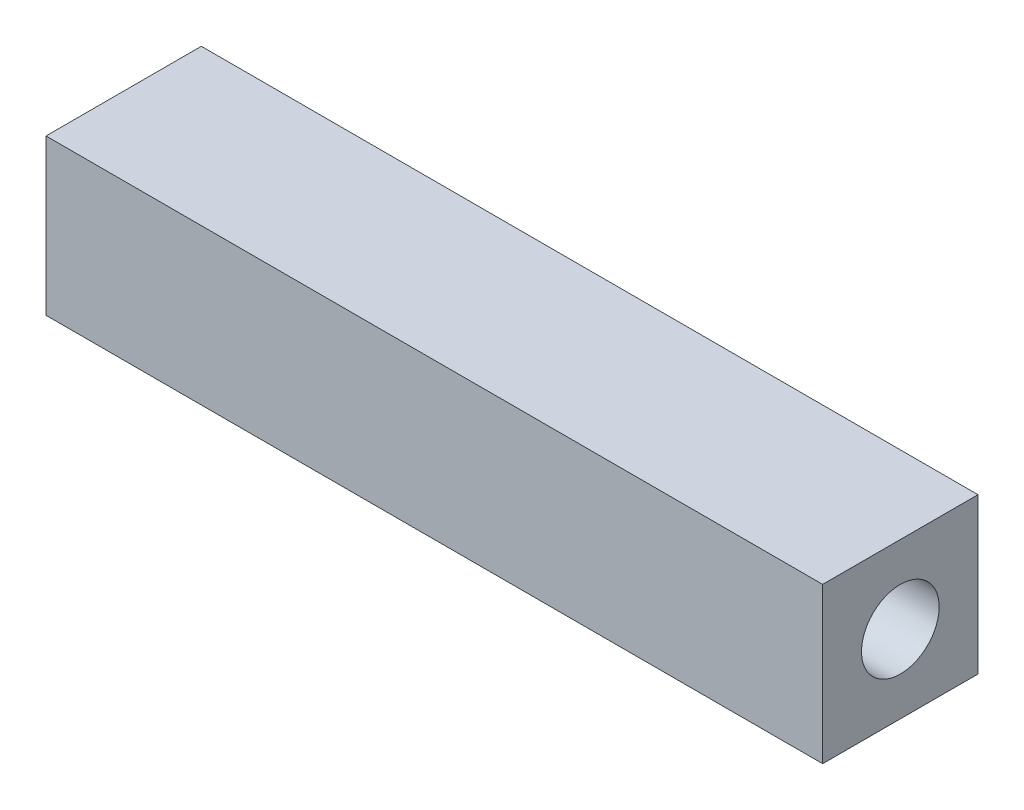
ISO-10303-21;
HEADER;
FILE_DESCRIPTION(('STEP AP214'),'2;1');
FILE_NAME('part.step','',(''),(''),'','','');
FILE_SCHEMA(('AUTOMOTIVE_DESIGN { 1 0 10303 214 1 1 1 1 }'));
ENDSEC;
DATA;
#1=APPLICATION_CONTEXT('core data for automotive mechanical design processes');
#2=APPLICATION_PROTOCOL_DEFINITION('international standard','automotive_design',2000,#1);
#3=PRODUCT_CONTEXT('',#1,'mechanical');
#4=PRODUCT('Part','Part','',(#3));
#5=PRODUCT_RELATED_PRODUCT_CATEGORY('part','',(#4));
#6=PRODUCT_DEFINITION_FORMATION('','',#4);
#7=PRODUCT_DEFINITION_CONTEXT('part definition',#1,'design');
#8=PRODUCT_DEFINITION('design','',#6,#7);
#9=PRODUCT_DEFINITION_SHAPE('','',#8);
#10=(LENGTH_UNIT() NAMED_UNIT(*) SI_UNIT(.MILLI.,.METRE.));
#11=(NAMED_UNIT(*) PLANE_ANGLE_UNIT() SI_UNIT($,.RADIAN.));
#12=(NAMED_UNIT(*) SI_UNIT($,.STERADIAN.) SOLID_ANGLE_UNIT());
#13=UNCERTAINTY_MEASURE_WITH_UNIT(LENGTH_MEASURE(1.E-05),#10,'distance_accuracy_value','');
#14=(GEOMETRIC_REPRESENTATION_CONTEXT(3) GLOBAL_UNCERTAINTY_ASSIGNED_CONTEXT((#13)) GLOBAL_UNIT_ASSIGNED_CONTEXT((#10,
#11,#12)) REPRESENTATION_CONTEXT('',''));
#15=CARTESIAN_POINT('',(0.,0.,0.));
#16=DIRECTION('',(0.,0.,1.));
#17=DIRECTION('',(1.,0.,0.));
#18=AXIS2_PLACEMENT_3D('',#15,#16,#17);
#19=CARTESIAN_POINT('',(100.,0.,0.));
#20=DIRECTION('',(-1.,0.,0.));
#21=DIRECTION('',(0.,0.,1.));
#22=AXIS2_PLACEMENT_3D('',#19,#20,#21);
#23=PLANE('',#22);
#24=DIRECTION('',(0.,-1.,0.));
#25=VECTOR('',#24,1.);
#26=CARTESIAN_POINT('',(100.,0.,0.));
#27=LINE('',#26,#25);
#28=CARTESIAN_POINT('',(100.,20.,0.));
#29=VERTEX_POINT('',#28);
#30=CARTESIAN_POINT('',(100.,0.,0.));
#31=VERTEX_POINT('',#30);
#32=EDGE_CURVE('E84',#29,#31,#27,.T.);
#33=ORIENTED_EDGE('',*,*,#32,.T.);
#34=DIRECTION('',(0.,0.,-1.));
#35=VECTOR('',#34,1.);
#36=CARTESIAN_POINT('',(100.,0.,0.));
#37=LINE('',#36,#35);
#38=CARTESIAN_POINT('',(100.,0.,-20.));
#39=VERTEX_POINT('',#38);
#40=EDGE_CURVE('E79',#31,#39,#37,.T.);
#41=ORIENTED_EDGE('',*,*,#40,.T.);
#42=DIRECTION('',(0.,1.,0.));
#43=VECTOR('',#42,1.);
#44=CARTESIAN_POINT('',(100.,0.,-20.));
#45=LINE('',#44,#43);
#46=CARTESIAN_POINT('',(100.,20.,-20.));
#47=VERTEX_POINT('',#46);
#48=EDGE_CURVE('E82',#39,#47,#45,.T.);
#49=ORIENTED_EDGE('',*,*,#48,.T.);
#50=DIRECTION('',(0.,0.,1.));
#51=VECTOR('',#50,1.);
#52=CARTESIAN_POINT('',(100.,20.,0.));
#53=LINE('',#52,#51);
#54=EDGE_CURVE('E49',#47,#29,#53,.T.);
#55=ORIENTED_EDGE('',*,*,#54,.T.);
#56=EDGE_LOOP('',(#33,#41,#49,#55));
#57=FACE_BOUND('',#56,.T.);
#58=CARTESIAN_POINT('',(100.,10.,-10.));
#59=DIRECTION('',(1.,0.,0.));
#60=DIRECTION('',(0.,0.,-1.));
#61=AXIS2_PLACEMENT_3D('',#58,#59,#60);
#62=CIRCLE('',#61,5.);
#63=CARTESIAN_POINT('',(100.,10.,-15.));
#64=VERTEX_POINT('',#63);
#65=EDGE_CURVE('E99',#64,#64,#62,.T.);
#66=ORIENTED_EDGE('',*,*,#65,.F.);
#67=EDGE_LOOP('',(#66));
#68=FACE_BOUND('',#67,.T.);
#69=ADVANCED_FACE('F32',(#57,#68),#23,.F.);
#70=CARTESIAN_POINT('',(0.,0.,0.));
#71=DIRECTION('',(-1.,0.,0.));
#72=DIRECTION('',(0.,0.,1.));
#73=AXIS2_PLACEMENT_3D('',#70,#71,#72);
#74=PLANE('',#73);
#75=DIRECTION('',(0.,-1.,0.));
#76=VECTOR('',#75,1.);
#77=CARTESIAN_POINT('',(0.,0.,0.));
#78=LINE('',#77,#76);
#79=CARTESIAN_POINT('',(0.,20.,0.));
#80=VERTEX_POINT('',#79);
#81=CARTESIAN_POINT('',(0.,0.,0.));
#82=VERTEX_POINT('',#81);
#83=EDGE_CURVE('E96',#80,#82,#78,.T.);
#84=ORIENTED_EDGE('',*,*,#83,.F.);
#85=DIRECTION('',(0.,0.,1.));
#86=VECTOR('',#85,1.);
#87=CARTESIAN_POINT('',(0.,20.,0.));
#88=LINE('',#87,#86);
#89=CARTESIAN_POINT('',(0.,20.,-20.));
#90=VERTEX_POINT('',#89);
#91=EDGE_CURVE('E72',#90,#80,#88,.T.);
#92=ORIENTED_EDGE('',*,*,#91,.F.);
#93=DIRECTION('',(0.,1.,0.));
#94=VECTOR('',#93,1.);
#95=CARTESIAN_POINT('',(0.,0.,-20.));
#96=LINE('',#95,#94);
#97=CARTESIAN_POINT('',(0.,0.,-20.));
#98=VERTEX_POINT('',#97);
#99=EDGE_CURVE('E66',#98,#90,#96,.T.);
#100=ORIENTED_EDGE('',*,*,#99,.F.);
#101=DIRECTION('',(0.,0.,-1.));
#102=VECTOR('',#101,1.);
#103=CARTESIAN_POINT('',(0.,0.,0.));
#104=LINE('',#103,#102);
#105=EDGE_CURVE('E88',#82,#98,#104,.T.);
#106=ORIENTED_EDGE('',*,*,#105,.F.);
#107=EDGE_LOOP('',(#84,#92,#100,#106));
#108=FACE_BOUND('',#107,.T.);
#109=CARTESIAN_POINT('',(0.,10.,-10.));
#110=DIRECTION('',(1.,0.,0.));
#111=DIRECTION('',(0.,0.,-1.));
#112=AXIS2_PLACEMENT_3D('',#109,#110,#111);
#113=CIRCLE('',#112,5.);
#114=CARTESIAN_POINT('',(0.,10.,-15.));
#115=VERTEX_POINT('',#114);
#116=EDGE_CURVE('E111',#115,#115,#113,.T.);
#117=ORIENTED_EDGE('',*,*,#116,.T.);
#118=EDGE_LOOP('',(#117));
#119=FACE_BOUND('',#118,.T.);
#120=ADVANCED_FACE('F107',(#108,#119),#74,.T.);
#121=CARTESIAN_POINT('',(100.,0.,0.));
#122=DIRECTION('',(0.,0.,-1.));
#123=DIRECTION('',(-1.,0.,0.));
#124=AXIS2_PLACEMENT_3D('',#121,#122,#123);
#125=PLANE('',#124);
#126=ORIENTED_EDGE('',*,*,#83,.T.);
#127=DIRECTION('',(-1.,0.,0.));
#128=VECTOR('',#127,1.);
#129=CARTESIAN_POINT('',(100.,0.,0.));
#130=LINE('',#129,#128);
#131=EDGE_CURVE('E11',#31,#82,#130,.T.);
#132=ORIENTED_EDGE('',*,*,#131,.F.);
#133=ORIENTED_EDGE('',*,*,#32,.F.);
#134=DIRECTION('',(-1.,0.,0.));
#135=VECTOR('',#134,1.);
#136=CARTESIAN_POINT('',(100.,20.,0.));
#137=LINE('',#136,#135);
#138=EDGE_CURVE('E92',#29,#80,#137,.T.);
#139=ORIENTED_EDGE('',*,*,#138,.T.);
#140=EDGE_LOOP('',(#126,#132,#133,#139));
#141=FACE_BOUND('',#140,.T.);
#142=ADVANCED_FACE('F34',(#141),#125,.F.);
#143=CARTESIAN_POINT('',(100.,0.,0.));
#144=DIRECTION('',(0.,1.,0.));
#145=DIRECTION('',(0.,0.,1.));
#146=AXIS2_PLACEMENT_3D('',#143,#144,#145);
#147=PLANE('',#146);
#148=ORIENTED_EDGE('',*,*,#105,.T.);
#149=DIRECTION('',(-1.,0.,0.));
#150=VECTOR('',#149,1.);
#151=CARTESIAN_POINT('',(100.,0.,-20.));
#152=LINE('',#151,#150);
#153=EDGE_CURVE('E41',#39,#98,#152,.T.);
#154=ORIENTED_EDGE('',*,*,#153,.F.);
#155=ORIENTED_EDGE('',*,*,#40,.F.);
#156=ORIENTED_EDGE('',*,*,#131,.T.);
#157=EDGE_LOOP('',(#148,#154,#155,#156));
#158=FACE_BOUND('',#157,.T.);
#159=ADVANCED_FACE('F87',(#158),#147,.F.);
#160=CARTESIAN_POINT('',(100.,0.,-20.));
#161=DIRECTION('',(0.,0.,1.));
#162=DIRECTION('',(1.,0.,0.));
#163=AXIS2_PLACEMENT_3D('',#160,#161,#162);
#164=PLANE('',#163);
#165=ORIENTED_EDGE('',*,*,#99,.T.);
#166=DIRECTION('',(-1.,0.,0.));
#167=VECTOR('',#166,1.);
#168=CARTESIAN_POINT('',(100.,20.,-20.));
#169=LINE('',#168,#167);
#170=EDGE_CURVE('E89',#47,#90,#169,.T.);
#171=ORIENTED_EDGE('',*,*,#170,.F.);
#172=ORIENTED_EDGE('',*,*,#48,.F.);
#173=ORIENTED_EDGE('',*,*,#153,.T.);
#174=EDGE_LOOP('',(#165,#171,#172,#173));
#175=FACE_BOUND('',#174,.T.);
#176=ADVANCED_FACE('F90',(#175),#164,.F.);
#177=CARTESIAN_POINT('',(100.,20.,0.));
#178=DIRECTION('',(0.,-1.,0.));
#179=DIRECTION('',(0.,0.,-1.));
#180=AXIS2_PLACEMENT_3D('',#177,#178,#179);
#181=PLANE('',#180);
#182=ORIENTED_EDGE('',*,*,#91,.T.);
#183=ORIENTED_EDGE('',*,*,#138,.F.);
#184=ORIENTED_EDGE('',*,*,#54,.F.);
#185=ORIENTED_EDGE('',*,*,#170,.T.);
#186=EDGE_LOOP('',(#182,#183,#184,#185));
#187=FACE_BOUND('',#186,.T.);
#188=ADVANCED_FACE('F104',(#187),#181,.F.);
#189=CARTESIAN_POINT('',(100.,10.,-10.));
#190=DIRECTION('',(-1.,0.,0.));
#191=DIRECTION('',(0.,0.,1.));
#192=AXIS2_PLACEMENT_3D('',#189,#190,#191);
#193=CYLINDRICAL_SURFACE('',#192,5.);
#194=ORIENTED_EDGE('',*,*,#65,.T.);
#195=EDGE_LOOP('',(#194));
#196=FACE_BOUND('',#195,.T.);
#197=ORIENTED_EDGE('',*,*,#116,.F.);
#198=EDGE_LOOP('',(#197));
#199=FACE_BOUND('',#198,.T.);
#200=ADVANCED_FACE('F117',(#196,#199),#193,.F.);
#201=CLOSED_SHELL('',(#69,#120,#142,#159,#176,#188,#200));
#202=MANIFOLD_SOLID_BREP('B2',#201);
#203=ADVANCED_BREP_SHAPE_REPRESENTATION('',(#18,#202),#14);
#204=SHAPE_DEFINITION_REPRESENTATION(#9,#203);
ENDSEC;
END-ISO-10303-21;
